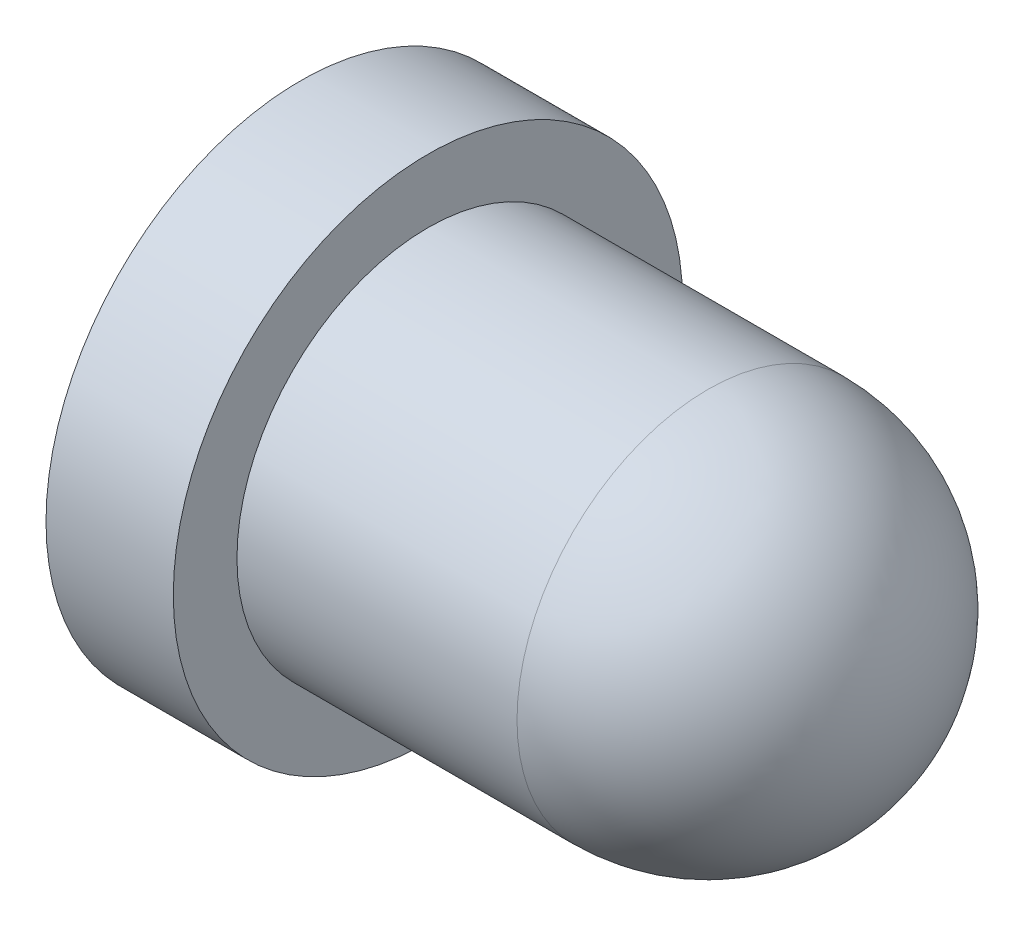
ISO-10303-21;
HEADER;
FILE_DESCRIPTION(('STEP AP214'),'2;1');
FILE_NAME('part.step','',(''),(''),'','','');
FILE_SCHEMA(('AUTOMOTIVE_DESIGN { 1 0 10303 214 1 1 1 1 }'));
ENDSEC;
DATA;
#1=APPLICATION_CONTEXT('core data for automotive mechanical design processes');
#2=APPLICATION_PROTOCOL_DEFINITION('international standard','automotive_design',2000,#1);
#3=PRODUCT_CONTEXT('',#1,'mechanical');
#4=PRODUCT('Part','Part','',(#3));
#5=PRODUCT_RELATED_PRODUCT_CATEGORY('part','',(#4));
#6=PRODUCT_DEFINITION_FORMATION('','',#4);
#7=PRODUCT_DEFINITION_CONTEXT('part definition',#1,'design');
#8=PRODUCT_DEFINITION('design','',#6,#7);
#9=PRODUCT_DEFINITION_SHAPE('','',#8);
#10=(LENGTH_UNIT() NAMED_UNIT(*) SI_UNIT(.MILLI.,.METRE.));
#11=(NAMED_UNIT(*) PLANE_ANGLE_UNIT() SI_UNIT($,.RADIAN.));
#12=(NAMED_UNIT(*) SI_UNIT($,.STERADIAN.) SOLID_ANGLE_UNIT());
#13=UNCERTAINTY_MEASURE_WITH_UNIT(LENGTH_MEASURE(1.E-05),#10,'distance_accuracy_value','');
#14=(GEOMETRIC_REPRESENTATION_CONTEXT(3) GLOBAL_UNCERTAINTY_ASSIGNED_CONTEXT((#13)) GLOBAL_UNIT_ASSIGNED_CONTEXT((#10,
#11,#12)) REPRESENTATION_CONTEXT('',''));
#15=CARTESIAN_POINT('',(0.,0.,0.));
#16=DIRECTION('',(0.,0.,1.));
#17=DIRECTION('',(1.,0.,0.));
#18=AXIS2_PLACEMENT_3D('',#15,#16,#17);
#19=CARTESIAN_POINT('',(1.,0.,0.));
#20=DIRECTION('',(-1.,0.,0.));
#21=DIRECTION('',(0.,0.,1.));
#22=AXIS2_PLACEMENT_3D('',#19,#20,#21);
#23=CYLINDRICAL_SURFACE('',#22,2.);
#24=CARTESIAN_POINT('',(1.,0.,0.));
#25=DIRECTION('',(1.,0.,0.));
#26=DIRECTION('',(0.,0.,-1.));
#27=AXIS2_PLACEMENT_3D('',#24,#25,#26);
#28=CIRCLE('',#27,2.);
#29=CARTESIAN_POINT('',(1.,0.,-2.));
#30=VERTEX_POINT('',#29);
#31=EDGE_CURVE('E50',#30,#30,#28,.T.);
#32=ORIENTED_EDGE('',*,*,#31,.F.);
#33=EDGE_LOOP('',(#32));
#34=FACE_BOUND('',#33,.T.);
#35=CARTESIAN_POINT('',(0.,0.,0.));
#36=DIRECTION('',(1.,0.,0.));
#37=DIRECTION('',(0.,0.,-1.));
#38=AXIS2_PLACEMENT_3D('',#35,#36,#37);
#39=CIRCLE('',#38,2.);
#40=CARTESIAN_POINT('',(0.,0.,-2.));
#41=VERTEX_POINT('',#40);
#42=EDGE_CURVE('E56',#41,#41,#39,.T.);
#43=ORIENTED_EDGE('',*,*,#42,.T.);
#44=EDGE_LOOP('',(#43));
#45=FACE_BOUND('',#44,.T.);
#46=ADVANCED_FACE('F37',(#34,#45),#23,.T.);
#47=CARTESIAN_POINT('',(1.,0.,0.));
#48=DIRECTION('',(1.,0.,0.));
#49=DIRECTION('',(0.,0.,-1.));
#50=AXIS2_PLACEMENT_3D('',#47,#48,#49);
#51=PLANE('',#50);
#52=CARTESIAN_POINT('',(1.,0.,0.));
#53=DIRECTION('',(1.,0.,0.));
#54=DIRECTION('',(0.,0.,-1.));
#55=AXIS2_PLACEMENT_3D('',#52,#53,#54);
#56=CIRCLE('',#55,1.5);
#57=CARTESIAN_POINT('',(1.,0.,-1.5));
#58=VERTEX_POINT('',#57);
#59=EDGE_CURVE('E45',#58,#58,#56,.T.);
#60=ORIENTED_EDGE('',*,*,#59,.F.);
#61=EDGE_LOOP('',(#60));
#62=FACE_BOUND('',#61,.T.);
#63=ORIENTED_EDGE('',*,*,#31,.T.);
#64=EDGE_LOOP('',(#63));
#65=FACE_BOUND('',#64,.T.);
#66=ADVANCED_FACE('F66',(#62,#65),#51,.T.);
#67=CARTESIAN_POINT('',(0.,0.,0.));
#68=DIRECTION('',(1.,0.,0.));
#69=DIRECTION('',(0.,0.,-1.));
#70=AXIS2_PLACEMENT_3D('',#67,#68,#69);
#71=PLANE('',#70);
#72=ORIENTED_EDGE('',*,*,#42,.F.);
#73=EDGE_LOOP('',(#72));
#74=FACE_BOUND('',#73,.T.);
#75=ADVANCED_FACE('F63',(#74),#71,.F.);
#76=CARTESIAN_POINT('',(4.7,0.,0.));
#77=DIRECTION('',(-1.,0.,0.));
#78=DIRECTION('',(0.,0.,1.));
#79=AXIS2_PLACEMENT_3D('',#76,#77,#78);
#80=CYLINDRICAL_SURFACE('',#79,1.5);
#81=CARTESIAN_POINT('',(3.2,0.,0.));
#82=DIRECTION('',(-1.,0.,0.));
#83=DIRECTION('',(0.,0.,1.));
#84=AXIS2_PLACEMENT_3D('',#81,#82,#83);
#85=CIRCLE('',#84,1.5);
#86=CARTESIAN_POINT('',(3.2,0.,1.5));
#87=VERTEX_POINT('',#86);
#88=EDGE_CURVE('E10',#87,#87,#85,.T.);
#89=ORIENTED_EDGE('',*,*,#88,.T.);
#90=EDGE_LOOP('',(#89));
#91=FACE_BOUND('',#90,.T.);
#92=ORIENTED_EDGE('',*,*,#59,.T.);
#93=EDGE_LOOP('',(#92));
#94=FACE_BOUND('',#93,.T.);
#95=ADVANCED_FACE('F65',(#91,#94),#80,.T.);
#96=CARTESIAN_POINT('',(3.2,0.,0.));
#97=DIRECTION('',(1.,0.,0.));
#98=DIRECTION('',(0.,0.,-1.));
#99=AXIS2_PLACEMENT_3D('',#96,#97,#98);
#100=SPHERICAL_SURFACE('',#99,1.5);
#101=ORIENTED_EDGE('',*,*,#88,.F.);
#102=EDGE_LOOP('',(#101));
#103=FACE_BOUND('',#102,.T.);
#104=ADVANCED_FACE('F39',(#103),#100,.T.);
#105=CLOSED_SHELL('',(#46,#66,#75,#95,#104));
#106=MANIFOLD_SOLID_BREP('B2',#105);
#107=ADVANCED_BREP_SHAPE_REPRESENTATION('',(#18,#106),#14);
#108=SHAPE_DEFINITION_REPRESENTATION(#9,#107);
ENDSEC;
END-ISO-10303-21;
